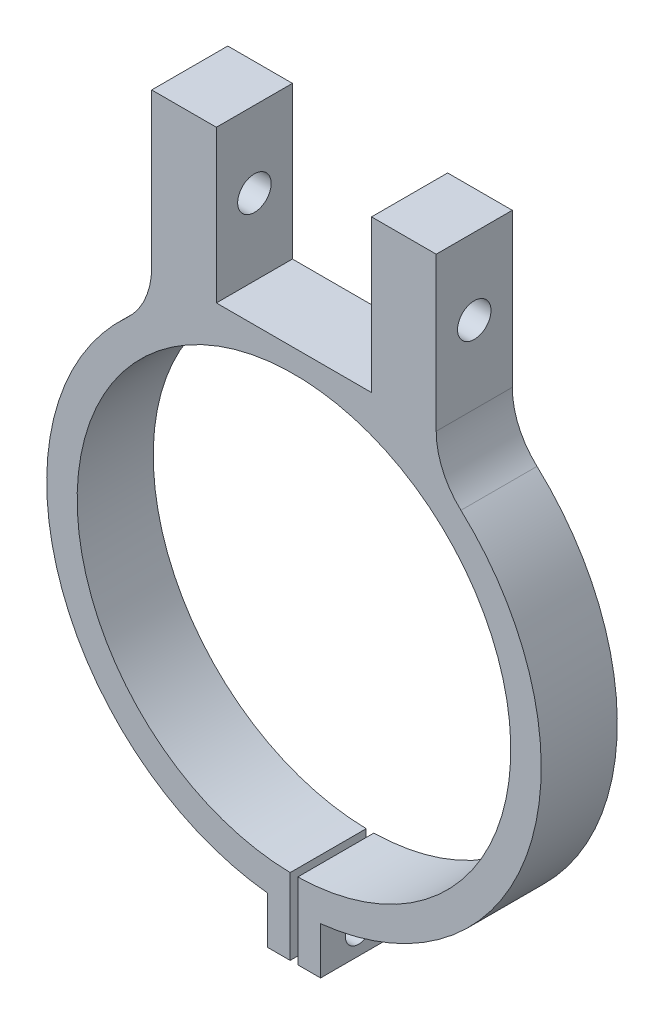
ISO-10303-21;
HEADER;
FILE_DESCRIPTION(('STEP AP214'),'2;1');
FILE_NAME('part.step','',(''),(''),'','','');
FILE_SCHEMA(('AUTOMOTIVE_DESIGN { 1 0 10303 214 1 1 1 1 }'));
ENDSEC;
DATA;
#1=APPLICATION_CONTEXT('core data for automotive mechanical design processes');
#2=APPLICATION_PROTOCOL_DEFINITION('international standard','automotive_design',2000,#1);
#3=PRODUCT_CONTEXT('',#1,'mechanical');
#4=PRODUCT('Part','Part','',(#3));
#5=PRODUCT_RELATED_PRODUCT_CATEGORY('part','',(#4));
#6=PRODUCT_DEFINITION_FORMATION('','',#4);
#7=PRODUCT_DEFINITION_CONTEXT('part definition',#1,'design');
#8=PRODUCT_DEFINITION('design','',#6,#7);
#9=PRODUCT_DEFINITION_SHAPE('','',#8);
#10=(LENGTH_UNIT() NAMED_UNIT(*) SI_UNIT(.MILLI.,.METRE.));
#11=(NAMED_UNIT(*) PLANE_ANGLE_UNIT() SI_UNIT($,.RADIAN.));
#12=(NAMED_UNIT(*) SI_UNIT($,.STERADIAN.) SOLID_ANGLE_UNIT());
#13=UNCERTAINTY_MEASURE_WITH_UNIT(LENGTH_MEASURE(1.E-05),#10,'distance_accuracy_value','');
#14=(GEOMETRIC_REPRESENTATION_CONTEXT(3) GLOBAL_UNCERTAINTY_ASSIGNED_CONTEXT((#13)) GLOBAL_UNIT_ASSIGNED_CONTEXT((#10,
#11,#12)) REPRESENTATION_CONTEXT('',''));
#15=CARTESIAN_POINT('',(0.,0.,0.));
#16=DIRECTION('',(0.,0.,1.));
#17=DIRECTION('',(1.,0.,0.));
#18=AXIS2_PLACEMENT_3D('',#15,#16,#17);
#19=CARTESIAN_POINT('',(3.5,-38.4961536185438,10.));
#20=DIRECTION('',(-1.,0.,0.));
#21=DIRECTION('',(0.,0.,1.));
#22=AXIS2_PLACEMENT_3D('',#19,#20,#21);
#23=PLANE('',#22);
#24=CARTESIAN_POINT('',(3.5,-35.4035712306754,5.));
#25=DIRECTION('',(-1.,0.,0.));
#26=DIRECTION('',(0.,0.,1.));
#27=AXIS2_PLACEMENT_3D('',#24,#25,#26);
#28=CIRCLE('',#27,1.75);
#29=CARTESIAN_POINT('',(3.5,-35.4035712306754,6.75));
#30=VERTEX_POINT('',#29);
#31=EDGE_CURVE('E227',#30,#30,#28,.T.);
#32=ORIENTED_EDGE('',*,*,#31,.T.);
#33=EDGE_LOOP('',(#32));
#34=FACE_BOUND('',#33,.T.);
#35=DIRECTION('',(0.,1.,0.));
#36=VECTOR('',#35,1.);
#37=CARTESIAN_POINT('',(3.5,-38.4961536185438,0.));
#38=LINE('',#37,#36);
#39=CARTESIAN_POINT('',(3.5,-38.4961536185438,0.));
#40=VERTEX_POINT('',#39);
#41=CARTESIAN_POINT('',(3.49999999999998,-32.310988842807,0.));
#42=VERTEX_POINT('',#41);
#43=EDGE_CURVE('E185',#40,#42,#38,.T.);
#44=ORIENTED_EDGE('',*,*,#43,.T.);
#45=DIRECTION('',(0.,0.,-1.));
#46=VECTOR('',#45,1.);
#47=CARTESIAN_POINT('',(3.49999999999998,-32.310988842807,10.));
#48=LINE('',#47,#46);
#49=CARTESIAN_POINT('',(3.49999999999998,-32.310988842807,10.));
#50=VERTEX_POINT('',#49);
#51=EDGE_CURVE('E166',#50,#42,#48,.T.);
#52=ORIENTED_EDGE('',*,*,#51,.F.);
#53=DIRECTION('',(0.,1.,0.));
#54=VECTOR('',#53,1.);
#55=CARTESIAN_POINT('',(3.5,-38.4961536185438,10.));
#56=LINE('',#55,#54);
#57=CARTESIAN_POINT('',(3.5,-38.4961536185438,10.));
#58=VERTEX_POINT('',#57);
#59=EDGE_CURVE('E173',#58,#50,#56,.T.);
#60=ORIENTED_EDGE('',*,*,#59,.F.);
#61=DIRECTION('',(0.,0.,-1.));
#62=VECTOR('',#61,1.);
#63=CARTESIAN_POINT('',(3.5,-38.4961536185438,10.));
#64=LINE('',#63,#62);
#65=EDGE_CURVE('E257',#58,#40,#64,.T.);
#66=ORIENTED_EDGE('',*,*,#65,.T.);
#67=EDGE_LOOP('',(#44,#52,#60,#66));
#68=FACE_BOUND('',#67,.T.);
#69=ADVANCED_FACE('F36',(#34,#68),#23,.F.);
#70=CARTESIAN_POINT('',(0.,0.,10.));
#71=DIRECTION('',(0.,0.,-1.));
#72=DIRECTION('',(-1.,0.,0.));
#73=AXIS2_PLACEMENT_3D('',#70,#71,#72);
#74=CYLINDRICAL_SURFACE('',#73,32.5);
#75=CARTESIAN_POINT('',(0.,0.,0.));
#76=DIRECTION('',(0.,0.,1.));
#77=DIRECTION('',(1.,0.,0.));
#78=AXIS2_PLACEMENT_3D('',#75,#76,#77);
#79=CIRCLE('',#78,32.5);
#80=CARTESIAN_POINT('',(21.9470588235294,23.970327678122,0.));
#81=VERTEX_POINT('',#80);
#82=EDGE_CURVE('E221',#42,#81,#79,.T.);
#83=ORIENTED_EDGE('',*,*,#82,.T.);
#84=DIRECTION('',(0.,0.,-1.));
#85=VECTOR('',#84,1.);
#86=CARTESIAN_POINT('',(21.9470588235294,23.970327678122,10.));
#87=LINE('',#86,#85);
#88=CARTESIAN_POINT('',(21.9470588235294,23.970327678122,10.));
#89=VERTEX_POINT('',#88);
#90=EDGE_CURVE('E169',#81,#89,#87,.F.);
#91=ORIENTED_EDGE('',*,*,#90,.T.);
#92=CARTESIAN_POINT('',(0.,0.,10.));
#93=DIRECTION('',(0.,0.,1.));
#94=DIRECTION('',(1.,0.,0.));
#95=AXIS2_PLACEMENT_3D('',#92,#93,#94);
#96=CIRCLE('',#95,32.5);
#97=EDGE_CURVE('E161',#50,#89,#96,.T.);
#98=ORIENTED_EDGE('',*,*,#97,.F.);
#99=ORIENTED_EDGE('',*,*,#51,.T.);
#100=EDGE_LOOP('',(#83,#91,#98,#99));
#101=FACE_BOUND('',#100,.T.);
#102=ADVANCED_FACE('F164',(#101),#74,.T.);
#103=CARTESIAN_POINT('',(18.7,51.5,10.));
#104=DIRECTION('',(-1.,0.,0.));
#105=DIRECTION('',(0.,0.,1.));
#106=AXIS2_PLACEMENT_3D('',#103,#104,#105);
#107=PLANE('',#106);
#108=CARTESIAN_POINT('',(18.7,41.5,5.));
#109=DIRECTION('',(-1.,0.,0.));
#110=DIRECTION('',(0.,0.,1.));
#111=AXIS2_PLACEMENT_3D('',#108,#109,#110);
#112=CIRCLE('',#111,2.2);
#113=CARTESIAN_POINT('',(18.7,41.5,7.2));
#114=VERTEX_POINT('',#113);
#115=EDGE_CURVE('E582',#114,#114,#112,.T.);
#116=ORIENTED_EDGE('',*,*,#115,.T.);
#117=EDGE_LOOP('',(#116));
#118=FACE_BOUND('',#117,.T.);
#119=DIRECTION('',(0.,1.,0.));
#120=VECTOR('',#119,1.);
#121=CARTESIAN_POINT('',(18.7,51.5,10.));
#122=LINE('',#121,#120);
#123=CARTESIAN_POINT('',(18.7,31.3458131175441,10.));
#124=VERTEX_POINT('',#123);
#125=CARTESIAN_POINT('',(18.7,51.5,10.));
#126=VERTEX_POINT('',#125);
#127=EDGE_CURVE('E172',#124,#126,#122,.T.);
#128=ORIENTED_EDGE('',*,*,#127,.F.);
#129=DIRECTION('',(0.,0.,1.));
#130=VECTOR('',#129,1.);
#131=CARTESIAN_POINT('',(18.7,31.3458131175441,0.));
#132=LINE('',#131,#130);
#133=CARTESIAN_POINT('',(18.7,31.3458131175441,0.));
#134=VERTEX_POINT('',#133);
#135=EDGE_CURVE('E186',#124,#134,#132,.F.);
#136=ORIENTED_EDGE('',*,*,#135,.T.);
#137=DIRECTION('',(0.,1.,0.));
#138=VECTOR('',#137,1.);
#139=CARTESIAN_POINT('',(18.7,51.5,0.));
#140=LINE('',#139,#138);
#141=CARTESIAN_POINT('',(18.7,51.5,0.));
#142=VERTEX_POINT('',#141);
#143=EDGE_CURVE('E223',#134,#142,#140,.T.);
#144=ORIENTED_EDGE('',*,*,#143,.T.);
#145=DIRECTION('',(0.,0.,-1.));
#146=VECTOR('',#145,1.);
#147=CARTESIAN_POINT('',(18.7,51.5,10.));
#148=LINE('',#147,#146);
#149=EDGE_CURVE('E187',#126,#142,#148,.T.);
#150=ORIENTED_EDGE('',*,*,#149,.F.);
#151=EDGE_LOOP('',(#128,#136,#144,#150));
#152=FACE_BOUND('',#151,.T.);
#153=ADVANCED_FACE('F214',(#118,#152),#107,.F.);
#154=CARTESIAN_POINT('',(10.2,51.5,10.));
#155=DIRECTION('',(0.,-1.,0.));
#156=DIRECTION('',(0.,0.,-1.));
#157=AXIS2_PLACEMENT_3D('',#154,#155,#156);
#158=PLANE('',#157);
#159=DIRECTION('',(-1.,0.,0.));
#160=VECTOR('',#159,1.);
#161=CARTESIAN_POINT('',(10.2,51.5,0.));
#162=LINE('',#161,#160);
#163=CARTESIAN_POINT('',(10.2,51.5,0.));
#164=VERTEX_POINT('',#163);
#165=EDGE_CURVE('E225',#142,#164,#162,.T.);
#166=ORIENTED_EDGE('',*,*,#165,.T.);
#167=DIRECTION('',(0.,0.,-1.));
#168=VECTOR('',#167,1.);
#169=CARTESIAN_POINT('',(10.2,51.5,10.));
#170=LINE('',#169,#168);
#171=CARTESIAN_POINT('',(10.2,51.5,10.));
#172=VERTEX_POINT('',#171);
#173=EDGE_CURVE('E192',#172,#164,#170,.T.);
#174=ORIENTED_EDGE('',*,*,#173,.F.);
#175=DIRECTION('',(-1.,0.,0.));
#176=VECTOR('',#175,1.);
#177=CARTESIAN_POINT('',(10.2,51.5,10.));
#178=LINE('',#177,#176);
#179=EDGE_CURVE('E217',#126,#172,#178,.T.);
#180=ORIENTED_EDGE('',*,*,#179,.F.);
#181=ORIENTED_EDGE('',*,*,#149,.T.);
#182=EDGE_LOOP('',(#166,#174,#180,#181));
#183=FACE_BOUND('',#182,.T.);
#184=ADVANCED_FACE('F501',(#183),#158,.F.);
#185=CARTESIAN_POINT('',(10.2,31.5,10.));
#186=DIRECTION('',(1.,0.,0.));
#187=DIRECTION('',(0.,0.,-1.));
#188=AXIS2_PLACEMENT_3D('',#185,#186,#187);
#189=PLANE('',#188);
#190=CARTESIAN_POINT('',(10.2,41.5,5.));
#191=DIRECTION('',(1.,0.,0.));
#192=DIRECTION('',(0.,0.,-1.));
#193=AXIS2_PLACEMENT_3D('',#190,#191,#192);
#194=CIRCLE('',#193,2.2);
#195=CARTESIAN_POINT('',(10.2,41.5,2.8));
#196=VERTEX_POINT('',#195);
#197=EDGE_CURVE('E585',#196,#196,#194,.T.);
#198=ORIENTED_EDGE('',*,*,#197,.T.);
#199=EDGE_LOOP('',(#198));
#200=FACE_BOUND('',#199,.T.);
#201=DIRECTION('',(0.,-1.,0.));
#202=VECTOR('',#201,1.);
#203=CARTESIAN_POINT('',(10.2,31.5,0.));
#204=LINE('',#203,#202);
#205=CARTESIAN_POINT('',(10.2,31.5,0.));
#206=VERTEX_POINT('',#205);
#207=EDGE_CURVE('E232',#164,#206,#204,.T.);
#208=ORIENTED_EDGE('',*,*,#207,.T.);
#209=DIRECTION('',(0.,0.,-1.));
#210=VECTOR('',#209,1.);
#211=CARTESIAN_POINT('',(10.2,31.5,10.));
#212=LINE('',#211,#210);
#213=CARTESIAN_POINT('',(10.2,31.5,10.));
#214=VERTEX_POINT('',#213);
#215=EDGE_CURVE('E286',#214,#206,#212,.T.);
#216=ORIENTED_EDGE('',*,*,#215,.F.);
#217=DIRECTION('',(0.,-1.,0.));
#218=VECTOR('',#217,1.);
#219=CARTESIAN_POINT('',(10.2,31.5,10.));
#220=LINE('',#219,#218);
#221=EDGE_CURVE('E295',#172,#214,#220,.T.);
#222=ORIENTED_EDGE('',*,*,#221,.F.);
#223=ORIENTED_EDGE('',*,*,#173,.T.);
#224=EDGE_LOOP('',(#208,#216,#222,#223));
#225=FACE_BOUND('',#224,.T.);
#226=ADVANCED_FACE('F293',(#200,#225),#189,.F.);
#227=CARTESIAN_POINT('',(-10.2,31.5,10.));
#228=DIRECTION('',(0.,-1.,0.));
#229=DIRECTION('',(0.,0.,-1.));
#230=AXIS2_PLACEMENT_3D('',#227,#228,#229);
#231=PLANE('',#230);
#232=DIRECTION('',(-1.,0.,0.));
#233=VECTOR('',#232,1.);
#234=CARTESIAN_POINT('',(-10.2,31.5,0.));
#235=LINE('',#234,#233);
#236=CARTESIAN_POINT('',(-10.2,31.5,0.));
#237=VERTEX_POINT('',#236);
#238=EDGE_CURVE('E234',#206,#237,#235,.T.);
#239=ORIENTED_EDGE('',*,*,#238,.T.);
#240=DIRECTION('',(0.,0.,-1.));
#241=VECTOR('',#240,1.);
#242=CARTESIAN_POINT('',(-10.2,31.5,10.));
#243=LINE('',#242,#241);
#244=CARTESIAN_POINT('',(-10.2,31.5,10.));
#245=VERTEX_POINT('',#244);
#246=EDGE_CURVE('E283',#245,#237,#243,.T.);
#247=ORIENTED_EDGE('',*,*,#246,.F.);
#248=DIRECTION('',(-1.,0.,0.));
#249=VECTOR('',#248,1.);
#250=CARTESIAN_POINT('',(-10.2,31.5,10.));
#251=LINE('',#250,#249);
#252=EDGE_CURVE('E311',#214,#245,#251,.T.);
#253=ORIENTED_EDGE('',*,*,#252,.F.);
#254=ORIENTED_EDGE('',*,*,#215,.T.);
#255=EDGE_LOOP('',(#239,#247,#253,#254));
#256=FACE_BOUND('',#255,.T.);
#257=ADVANCED_FACE('F302',(#256),#231,.F.);
#258=CARTESIAN_POINT('',(-10.2,31.5,10.));
#259=DIRECTION('',(-1.,0.,0.));
#260=DIRECTION('',(0.,0.,1.));
#261=AXIS2_PLACEMENT_3D('',#258,#259,#260);
#262=PLANE('',#261);
#263=CARTESIAN_POINT('',(-10.2,41.5,5.));
#264=DIRECTION('',(-1.,0.,0.));
#265=DIRECTION('',(0.,0.,1.));
#266=AXIS2_PLACEMENT_3D('',#263,#264,#265);
#267=CIRCLE('',#266,2.2);
#268=CARTESIAN_POINT('',(-10.2,41.5,7.2));
#269=VERTEX_POINT('',#268);
#270=EDGE_CURVE('E588',#269,#269,#267,.T.);
#271=ORIENTED_EDGE('',*,*,#270,.T.);
#272=EDGE_LOOP('',(#271));
#273=FACE_BOUND('',#272,.T.);
#274=DIRECTION('',(0.,1.,0.));
#275=VECTOR('',#274,1.);
#276=CARTESIAN_POINT('',(-10.2,31.5,0.));
#277=LINE('',#276,#275);
#278=CARTESIAN_POINT('',(-10.2,51.5,0.));
#279=VERTEX_POINT('',#278);
#280=EDGE_CURVE('E236',#237,#279,#277,.T.);
#281=ORIENTED_EDGE('',*,*,#280,.T.);
#282=DIRECTION('',(0.,0.,-1.));
#283=VECTOR('',#282,1.);
#284=CARTESIAN_POINT('',(-10.2,51.5,10.));
#285=LINE('',#284,#283);
#286=CARTESIAN_POINT('',(-10.2,51.5,10.));
#287=VERTEX_POINT('',#286);
#288=EDGE_CURVE('E280',#287,#279,#285,.T.);
#289=ORIENTED_EDGE('',*,*,#288,.F.);
#290=DIRECTION('',(0.,1.,0.));
#291=VECTOR('',#290,1.);
#292=CARTESIAN_POINT('',(-10.2,31.5,10.));
#293=LINE('',#292,#291);
#294=EDGE_CURVE('E308',#245,#287,#293,.T.);
#295=ORIENTED_EDGE('',*,*,#294,.F.);
#296=ORIENTED_EDGE('',*,*,#246,.T.);
#297=EDGE_LOOP('',(#281,#289,#295,#296));
#298=FACE_BOUND('',#297,.T.);
#299=ADVANCED_FACE('F306',(#273,#298),#262,.F.);
#300=CARTESIAN_POINT('',(-10.2,51.5,10.));
#301=DIRECTION('',(0.,-1.,0.));
#302=DIRECTION('',(0.,0.,-1.));
#303=AXIS2_PLACEMENT_3D('',#300,#301,#302);
#304=PLANE('',#303);
#305=DIRECTION('',(-1.,0.,0.));
#306=VECTOR('',#305,1.);
#307=CARTESIAN_POINT('',(-10.2,51.5,0.));
#308=LINE('',#307,#306);
#309=CARTESIAN_POINT('',(-18.7,51.5,0.));
#310=VERTEX_POINT('',#309);
#311=EDGE_CURVE('E238',#279,#310,#308,.T.);
#312=ORIENTED_EDGE('',*,*,#311,.T.);
#313=DIRECTION('',(0.,0.,-1.));
#314=VECTOR('',#313,1.);
#315=CARTESIAN_POINT('',(-18.7,51.5,10.));
#316=LINE('',#315,#314);
#317=CARTESIAN_POINT('',(-18.7,51.5,10.));
#318=VERTEX_POINT('',#317);
#319=EDGE_CURVE('E277',#318,#310,#316,.T.);
#320=ORIENTED_EDGE('',*,*,#319,.F.);
#321=DIRECTION('',(-1.,0.,0.));
#322=VECTOR('',#321,1.);
#323=CARTESIAN_POINT('',(-10.2,51.5,10.));
#324=LINE('',#323,#322);
#325=EDGE_CURVE('E310',#287,#318,#324,.T.);
#326=ORIENTED_EDGE('',*,*,#325,.F.);
#327=ORIENTED_EDGE('',*,*,#288,.T.);
#328=EDGE_LOOP('',(#312,#320,#326,#327));
#329=FACE_BOUND('',#328,.T.);
#330=ADVANCED_FACE('F366',(#329),#304,.F.);
#331=CARTESIAN_POINT('',(-18.7,51.5,10.));
#332=DIRECTION('',(1.,0.,0.));
#333=DIRECTION('',(0.,0.,-1.));
#334=AXIS2_PLACEMENT_3D('',#331,#332,#333);
#335=PLANE('',#334);
#336=CARTESIAN_POINT('',(-18.7,41.5,5.));
#337=DIRECTION('',(-1.,0.,0.));
#338=DIRECTION('',(0.,-1.,0.));
#339=AXIS2_PLACEMENT_3D('',#336,#337,#338);
#340=CIRCLE('',#339,2.2);
#341=CARTESIAN_POINT('',(-18.7,39.3,5.));
#342=VERTEX_POINT('',#341);
#343=EDGE_CURVE('E591',#342,#342,#340,.T.);
#344=ORIENTED_EDGE('',*,*,#343,.F.);
#345=EDGE_LOOP('',(#344));
#346=FACE_BOUND('',#345,.T.);
#347=DIRECTION('',(0.,-1.,0.));
#348=VECTOR('',#347,1.);
#349=CARTESIAN_POINT('',(-18.7,51.5,0.));
#350=LINE('',#349,#348);
#351=CARTESIAN_POINT('',(-18.7,31.3458131175441,0.));
#352=VERTEX_POINT('',#351);
#353=EDGE_CURVE('E240',#310,#352,#350,.T.);
#354=ORIENTED_EDGE('',*,*,#353,.T.);
#355=DIRECTION('',(0.,0.,1.));
#356=VECTOR('',#355,1.);
#357=CARTESIAN_POINT('',(-18.7,31.3458131175441,10.));
#358=LINE('',#357,#356);
#359=CARTESIAN_POINT('',(-18.7,31.3458131175441,10.));
#360=VERTEX_POINT('',#359);
#361=EDGE_CURVE('E51',#352,#360,#358,.T.);
#362=ORIENTED_EDGE('',*,*,#361,.T.);
#363=DIRECTION('',(0.,-1.,0.));
#364=VECTOR('',#363,1.);
#365=CARTESIAN_POINT('',(-18.7,51.5,10.));
#366=LINE('',#365,#364);
#367=EDGE_CURVE('E313',#318,#360,#366,.T.);
#368=ORIENTED_EDGE('',*,*,#367,.F.);
#369=ORIENTED_EDGE('',*,*,#319,.T.);
#370=EDGE_LOOP('',(#354,#362,#368,#369));
#371=FACE_BOUND('',#370,.T.);
#372=ADVANCED_FACE('F364',(#346,#371),#335,.F.);
#373=CARTESIAN_POINT('',(0.,0.,10.));
#374=DIRECTION('',(0.,0.,-1.));
#375=DIRECTION('',(-1.,0.,0.));
#376=AXIS2_PLACEMENT_3D('',#373,#374,#375);
#377=CYLINDRICAL_SURFACE('',#376,32.5);
#378=CARTESIAN_POINT('',(0.,0.,10.));
#379=DIRECTION('',(0.,0.,1.));
#380=DIRECTION('',(1.,0.,0.));
#381=AXIS2_PLACEMENT_3D('',#378,#379,#380);
#382=CIRCLE('',#381,32.5);
#383=CARTESIAN_POINT('',(-21.9470588235294,23.970327678122,10.));
#384=VERTEX_POINT('',#383);
#385=CARTESIAN_POINT('',(-3.5,-32.310988842807,10.));
#386=VERTEX_POINT('',#385);
#387=EDGE_CURVE('E319',#384,#386,#382,.T.);
#388=ORIENTED_EDGE('',*,*,#387,.F.);
#389=DIRECTION('',(0.,0.,-1.));
#390=VECTOR('',#389,1.);
#391=CARTESIAN_POINT('',(-21.9470588235294,23.970327678122,10.));
#392=LINE('',#391,#390);
#393=CARTESIAN_POINT('',(-21.9470588235294,23.970327678122,0.));
#394=VERTEX_POINT('',#393);
#395=EDGE_CURVE('E202',#384,#394,#392,.T.);
#396=ORIENTED_EDGE('',*,*,#395,.T.);
#397=CARTESIAN_POINT('',(0.,0.,0.));
#398=DIRECTION('',(0.,0.,1.));
#399=DIRECTION('',(1.,0.,0.));
#400=AXIS2_PLACEMENT_3D('',#397,#398,#399);
#401=CIRCLE('',#400,32.5);
#402=CARTESIAN_POINT('',(-3.5,-32.310988842807,0.));
#403=VERTEX_POINT('',#402);
#404=EDGE_CURVE('E242',#394,#403,#401,.T.);
#405=ORIENTED_EDGE('',*,*,#404,.T.);
#406=DIRECTION('',(0.,0.,-1.));
#407=VECTOR('',#406,1.);
#408=CARTESIAN_POINT('',(-3.5,-32.310988842807,10.));
#409=LINE('',#408,#407);
#410=EDGE_CURVE('E274',#386,#403,#409,.T.);
#411=ORIENTED_EDGE('',*,*,#410,.F.);
#412=EDGE_LOOP('',(#388,#396,#405,#411));
#413=FACE_BOUND('',#412,.T.);
#414=ADVANCED_FACE('F359',(#413),#377,.T.);
#415=CARTESIAN_POINT('',(-3.5,-38.4961536185438,10.));
#416=DIRECTION('',(1.,0.,0.));
#417=DIRECTION('',(0.,1.,0.));
#418=AXIS2_PLACEMENT_3D('',#415,#416,#417);
#419=PLANE('',#418);
#420=CARTESIAN_POINT('',(-3.50000000000001,-35.4035712306754,5.));
#421=DIRECTION('',(-1.,0.,0.));
#422=DIRECTION('',(0.,0.,1.));
#423=AXIS2_PLACEMENT_3D('',#420,#421,#422);
#424=CIRCLE('',#423,1.75);
#425=CARTESIAN_POINT('',(-3.50000000000001,-35.4035712306754,6.75));
#426=VERTEX_POINT('',#425);
#427=EDGE_CURVE('E199',#426,#426,#424,.T.);
#428=ORIENTED_EDGE('',*,*,#427,.F.);
#429=EDGE_LOOP('',(#428));
#430=FACE_BOUND('',#429,.T.);
#431=DIRECTION('',(0.,-1.,0.));
#432=VECTOR('',#431,1.);
#433=CARTESIAN_POINT('',(-3.5,-38.4961536185438,0.));
#434=LINE('',#433,#432);
#435=CARTESIAN_POINT('',(-3.5,-38.4961536185438,0.));
#436=VERTEX_POINT('',#435);
#437=EDGE_CURVE('E244',#403,#436,#434,.T.);
#438=ORIENTED_EDGE('',*,*,#437,.T.);
#439=DIRECTION('',(0.,0.,-1.));
#440=VECTOR('',#439,1.);
#441=CARTESIAN_POINT('',(-3.5,-38.4961536185438,10.));
#442=LINE('',#441,#440);
#443=CARTESIAN_POINT('',(-3.5,-38.4961536185438,10.));
#444=VERTEX_POINT('',#443);
#445=EDGE_CURVE('E271',#444,#436,#442,.T.);
#446=ORIENTED_EDGE('',*,*,#445,.F.);
#447=DIRECTION('',(0.,-1.,0.));
#448=VECTOR('',#447,1.);
#449=CARTESIAN_POINT('',(-3.5,-38.4961536185438,10.));
#450=LINE('',#449,#448);
#451=EDGE_CURVE('E321',#386,#444,#450,.T.);
#452=ORIENTED_EDGE('',*,*,#451,.F.);
#453=ORIENTED_EDGE('',*,*,#410,.T.);
#454=EDGE_LOOP('',(#438,#446,#452,#453));
#455=FACE_BOUND('',#454,.T.);
#456=ADVANCED_FACE('F355',(#430,#455),#419,.F.);
#457=CARTESIAN_POINT('',(-0.499999999999995,-38.4961536185438,10.));
#458=DIRECTION('',(0.,1.,0.));
#459=DIRECTION('',(0.,0.,1.));
#460=AXIS2_PLACEMENT_3D('',#457,#458,#459);
#461=PLANE('',#460);
#462=DIRECTION('',(1.,0.,0.));
#463=VECTOR('',#462,1.);
#464=CARTESIAN_POINT('',(-0.499999999999995,-38.4961536185438,0.));
#465=LINE('',#464,#463);
#466=CARTESIAN_POINT('',(-0.499999999999995,-38.4961536185438,0.));
#467=VERTEX_POINT('',#466);
#468=EDGE_CURVE('E246',#436,#467,#465,.T.);
#469=ORIENTED_EDGE('',*,*,#468,.T.);
#470=DIRECTION('',(0.,0.,-1.));
#471=VECTOR('',#470,1.);
#472=CARTESIAN_POINT('',(-0.499999999999995,-38.4961536185438,10.));
#473=LINE('',#472,#471);
#474=CARTESIAN_POINT('',(-0.499999999999995,-38.4961536185438,10.));
#475=VERTEX_POINT('',#474);
#476=EDGE_CURVE('E268',#475,#467,#473,.T.);
#477=ORIENTED_EDGE('',*,*,#476,.F.);
#478=DIRECTION('',(1.,0.,0.));
#479=VECTOR('',#478,1.);
#480=CARTESIAN_POINT('',(-0.499999999999995,-38.4961536185438,10.));
#481=LINE('',#480,#479);
#482=EDGE_CURVE('E323',#444,#475,#481,.T.);
#483=ORIENTED_EDGE('',*,*,#482,.F.);
#484=ORIENTED_EDGE('',*,*,#445,.T.);
#485=EDGE_LOOP('',(#469,#477,#483,#484));
#486=FACE_BOUND('',#485,.T.);
#487=ADVANCED_FACE('F350',(#486),#461,.F.);
#488=CARTESIAN_POINT('',(-0.499999999999997,-28.49561369755,10.));
#489=DIRECTION('',(-1.,0.,0.));
#490=DIRECTION('',(0.,-1.,0.));
#491=AXIS2_PLACEMENT_3D('',#488,#489,#490);
#492=PLANE('',#491);
#493=CARTESIAN_POINT('',(-0.499999999999994,-35.4035712306754,5.));
#494=DIRECTION('',(-1.,0.,0.));
#495=DIRECTION('',(0.,-1.,0.));
#496=AXIS2_PLACEMENT_3D('',#493,#494,#495);
#497=CIRCLE('',#496,1.75);
#498=CARTESIAN_POINT('',(-0.499999999999993,-37.1535712306754,5.));
#499=VERTEX_POINT('',#498);
#500=EDGE_CURVE('E198',#499,#499,#497,.T.);
#501=ORIENTED_EDGE('',*,*,#500,.T.);
#502=EDGE_LOOP('',(#501));
#503=FACE_BOUND('',#502,.T.);
#504=DIRECTION('',(0.,1.,0.));
#505=VECTOR('',#504,1.);
#506=CARTESIAN_POINT('',(-0.499999999999997,-28.49561369755,0.));
#507=LINE('',#506,#505);
#508=CARTESIAN_POINT('',(-0.499999999999976,-28.49561369755,0.));
#509=VERTEX_POINT('',#508);
#510=EDGE_CURVE('E249',#467,#509,#507,.T.);
#511=ORIENTED_EDGE('',*,*,#510,.T.);
#512=DIRECTION('',(0.,0.,-1.));
#513=VECTOR('',#512,1.);
#514=CARTESIAN_POINT('',(-0.499999999999976,-28.49561369755,10.));
#515=LINE('',#514,#513);
#516=CARTESIAN_POINT('',(-0.499999999999976,-28.49561369755,10.));
#517=VERTEX_POINT('',#516);
#518=EDGE_CURVE('E265',#517,#509,#515,.T.);
#519=ORIENTED_EDGE('',*,*,#518,.F.);
#520=DIRECTION('',(0.,1.,0.));
#521=VECTOR('',#520,1.);
#522=CARTESIAN_POINT('',(-0.499999999999996,-32.4961536185438,10.));
#523=LINE('',#522,#521);
#524=EDGE_CURVE('E325',#475,#517,#523,.T.);
#525=ORIENTED_EDGE('',*,*,#524,.F.);
#526=ORIENTED_EDGE('',*,*,#476,.T.);
#527=EDGE_LOOP('',(#511,#519,#525,#526));
#528=FACE_BOUND('',#527,.T.);
#529=ADVANCED_FACE('F345',(#503,#528),#492,.F.);
#530=CARTESIAN_POINT('',(0.,0.,10.));
#531=DIRECTION('',(0.,0.,-1.));
#532=DIRECTION('',(-1.,0.,0.));
#533=AXIS2_PLACEMENT_3D('',#530,#531,#532);
#534=CYLINDRICAL_SURFACE('',#533,28.5);
#535=CARTESIAN_POINT('',(0.,0.,0.));
#536=DIRECTION('',(0.,0.,-1.));
#537=DIRECTION('',(1.,0.,0.));
#538=AXIS2_PLACEMENT_3D('',#535,#536,#537);
#539=CIRCLE('',#538,28.5);
#540=CARTESIAN_POINT('',(0.500000000000003,-28.49561369755,0.));
#541=VERTEX_POINT('',#540);
#542=EDGE_CURVE('E251',#509,#541,#539,.T.);
#543=ORIENTED_EDGE('',*,*,#542,.T.);
#544=DIRECTION('',(0.,0.,-1.));
#545=VECTOR('',#544,1.);
#546=CARTESIAN_POINT('',(0.500000000000003,-28.49561369755,10.));
#547=LINE('',#546,#545);
#548=CARTESIAN_POINT('',(0.500000000000003,-28.49561369755,10.));
#549=VERTEX_POINT('',#548);
#550=EDGE_CURVE('E262',#549,#541,#547,.T.);
#551=ORIENTED_EDGE('',*,*,#550,.F.);
#552=CARTESIAN_POINT('',(0.,0.,10.));
#553=DIRECTION('',(0.,0.,-1.));
#554=DIRECTION('',(1.,0.,0.));
#555=AXIS2_PLACEMENT_3D('',#552,#553,#554);
#556=CIRCLE('',#555,28.5);
#557=EDGE_CURVE('E327',#517,#549,#556,.T.);
#558=ORIENTED_EDGE('',*,*,#557,.F.);
#559=ORIENTED_EDGE('',*,*,#518,.T.);
#560=EDGE_LOOP('',(#543,#551,#558,#559));
#561=FACE_BOUND('',#560,.T.);
#562=ADVANCED_FACE('F341',(#561),#534,.F.);
#563=CARTESIAN_POINT('',(0.500000000000004,-32.4961536185438,10.));
#564=DIRECTION('',(1.,0.,0.));
#565=DIRECTION('',(0.,1.,0.));
#566=AXIS2_PLACEMENT_3D('',#563,#564,#565);
#567=PLANE('',#566);
#568=CARTESIAN_POINT('',(0.5,-35.4035712306754,5.));
#569=DIRECTION('',(1.,0.,0.));
#570=DIRECTION('',(0.,1.,0.));
#571=AXIS2_PLACEMENT_3D('',#568,#569,#570);
#572=CIRCLE('',#571,1.75);
#573=CARTESIAN_POINT('',(0.5,-33.6535712306754,5.));
#574=VERTEX_POINT('',#573);
#575=EDGE_CURVE('E196',#574,#574,#572,.T.);
#576=ORIENTED_EDGE('',*,*,#575,.T.);
#577=EDGE_LOOP('',(#576));
#578=FACE_BOUND('',#577,.T.);
#579=DIRECTION('',(0.,-1.,0.));
#580=VECTOR('',#579,1.);
#581=CARTESIAN_POINT('',(0.500000000000004,-32.4961536185438,0.));
#582=LINE('',#581,#580);
#583=CARTESIAN_POINT('',(0.500000000000005,-38.4961536185438,0.));
#584=VERTEX_POINT('',#583);
#585=EDGE_CURVE('E254',#541,#584,#582,.T.);
#586=ORIENTED_EDGE('',*,*,#585,.T.);
#587=DIRECTION('',(0.,0.,-1.));
#588=VECTOR('',#587,1.);
#589=CARTESIAN_POINT('',(0.500000000000005,-38.4961536185438,10.));
#590=LINE('',#589,#588);
#591=CARTESIAN_POINT('',(0.500000000000005,-38.4961536185438,10.));
#592=VERTEX_POINT('',#591);
#593=EDGE_CURVE('E259',#592,#584,#590,.T.);
#594=ORIENTED_EDGE('',*,*,#593,.F.);
#595=DIRECTION('',(0.,-1.,0.));
#596=VECTOR('',#595,1.);
#597=CARTESIAN_POINT('',(0.500000000000003,-28.49561369755,10.));
#598=LINE('',#597,#596);
#599=EDGE_CURVE('E329',#549,#592,#598,.T.);
#600=ORIENTED_EDGE('',*,*,#599,.F.);
#601=ORIENTED_EDGE('',*,*,#550,.T.);
#602=EDGE_LOOP('',(#586,#594,#600,#601));
#603=FACE_BOUND('',#602,.T.);
#604=ADVANCED_FACE('F335',(#578,#603),#567,.F.);
#605=CARTESIAN_POINT('',(0.500000000000005,-38.4961536185438,10.));
#606=DIRECTION('',(0.,1.,0.));
#607=DIRECTION('',(0.,0.,1.));
#608=AXIS2_PLACEMENT_3D('',#605,#606,#607);
#609=PLANE('',#608);
#610=DIRECTION('',(1.,0.,0.));
#611=VECTOR('',#610,1.);
#612=CARTESIAN_POINT('',(0.500000000000005,-38.4961536185438,0.));
#613=LINE('',#612,#611);
#614=EDGE_CURVE('E182',#584,#40,#613,.T.);
#615=ORIENTED_EDGE('',*,*,#614,.T.);
#616=ORIENTED_EDGE('',*,*,#65,.F.);
#617=DIRECTION('',(1.,0.,0.));
#618=VECTOR('',#617,1.);
#619=CARTESIAN_POINT('',(0.500000000000005,-38.4961536185438,10.));
#620=LINE('',#619,#618);
#621=EDGE_CURVE('E178',#592,#58,#620,.T.);
#622=ORIENTED_EDGE('',*,*,#621,.F.);
#623=ORIENTED_EDGE('',*,*,#593,.T.);
#624=EDGE_LOOP('',(#615,#616,#622,#623));
#625=FACE_BOUND('',#624,.T.);
#626=ADVANCED_FACE('F338',(#625),#609,.F.);
#627=CARTESIAN_POINT('',(0.,0.,10.));
#628=DIRECTION('',(0.,0.,1.));
#629=DIRECTION('',(1.,0.,0.));
#630=AXIS2_PLACEMENT_3D('',#627,#628,#629);
#631=PLANE('',#630);
#632=ORIENTED_EDGE('',*,*,#59,.T.);
#633=ORIENTED_EDGE('',*,*,#97,.T.);
#634=CARTESIAN_POINT('',(28.7,31.3458131175441,10.));
#635=DIRECTION('',(0.,0.,1.));
#636=DIRECTION('',(1.,0.,0.));
#637=AXIS2_PLACEMENT_3D('',#634,#635,#636);
#638=CIRCLE('',#637,10.);
#639=EDGE_CURVE('E208',#89,#124,#638,.F.);
#640=ORIENTED_EDGE('',*,*,#639,.T.);
#641=ORIENTED_EDGE('',*,*,#127,.T.);
#642=ORIENTED_EDGE('',*,*,#179,.T.);
#643=ORIENTED_EDGE('',*,*,#221,.T.);
#644=ORIENTED_EDGE('',*,*,#252,.T.);
#645=ORIENTED_EDGE('',*,*,#294,.T.);
#646=ORIENTED_EDGE('',*,*,#325,.T.);
#647=ORIENTED_EDGE('',*,*,#367,.T.);
#648=CARTESIAN_POINT('',(-28.7,31.3458131175441,10.));
#649=DIRECTION('',(0.,0.,1.));
#650=DIRECTION('',(1.,0.,0.));
#651=AXIS2_PLACEMENT_3D('',#648,#649,#650);
#652=CIRCLE('',#651,10.);
#653=EDGE_CURVE('E11',#360,#384,#652,.F.);
#654=ORIENTED_EDGE('',*,*,#653,.T.);
#655=ORIENTED_EDGE('',*,*,#387,.T.);
#656=ORIENTED_EDGE('',*,*,#451,.T.);
#657=ORIENTED_EDGE('',*,*,#482,.T.);
#658=ORIENTED_EDGE('',*,*,#524,.T.);
#659=ORIENTED_EDGE('',*,*,#557,.T.);
#660=ORIENTED_EDGE('',*,*,#599,.T.);
#661=ORIENTED_EDGE('',*,*,#621,.T.);
#662=EDGE_LOOP('',(#632,#633,#640,#641,#642,#643,#644,#645,#646,#647,#654,#655,#656,#657,#658,
#659,#660,#661));
#663=FACE_BOUND('',#662,.T.);
#664=ADVANCED_FACE('F176',(#663),#631,.T.);
#665=CARTESIAN_POINT('',(0.,0.,0.));
#666=DIRECTION('',(0.,0.,1.));
#667=DIRECTION('',(1.,0.,0.));
#668=AXIS2_PLACEMENT_3D('',#665,#666,#667);
#669=PLANE('',#668);
#670=ORIENTED_EDGE('',*,*,#43,.F.);
#671=ORIENTED_EDGE('',*,*,#614,.F.);
#672=ORIENTED_EDGE('',*,*,#585,.F.);
#673=ORIENTED_EDGE('',*,*,#542,.F.);
#674=ORIENTED_EDGE('',*,*,#510,.F.);
#675=ORIENTED_EDGE('',*,*,#468,.F.);
#676=ORIENTED_EDGE('',*,*,#437,.F.);
#677=ORIENTED_EDGE('',*,*,#404,.F.);
#678=CARTESIAN_POINT('',(-28.7,31.3458131175441,0.));
#679=DIRECTION('',(0.,0.,1.));
#680=DIRECTION('',(1.,0.,0.));
#681=AXIS2_PLACEMENT_3D('',#678,#679,#680);
#682=CIRCLE('',#681,10.);
#683=EDGE_CURVE('E44',#394,#352,#682,.T.);
#684=ORIENTED_EDGE('',*,*,#683,.T.);
#685=ORIENTED_EDGE('',*,*,#353,.F.);
#686=ORIENTED_EDGE('',*,*,#311,.F.);
#687=ORIENTED_EDGE('',*,*,#280,.F.);
#688=ORIENTED_EDGE('',*,*,#238,.F.);
#689=ORIENTED_EDGE('',*,*,#207,.F.);
#690=ORIENTED_EDGE('',*,*,#165,.F.);
#691=ORIENTED_EDGE('',*,*,#143,.F.);
#692=CARTESIAN_POINT('',(28.7,31.3458131175441,0.));
#693=DIRECTION('',(0.,0.,1.));
#694=DIRECTION('',(1.,0.,0.));
#695=AXIS2_PLACEMENT_3D('',#692,#693,#694);
#696=CIRCLE('',#695,10.);
#697=EDGE_CURVE('E206',#134,#81,#696,.T.);
#698=ORIENTED_EDGE('',*,*,#697,.T.);
#699=ORIENTED_EDGE('',*,*,#82,.F.);
#700=EDGE_LOOP('',(#670,#671,#672,#673,#674,#675,#676,#677,#684,#685,#686,#687,#688,#689,#690,
#691,#698,#699));
#701=FACE_BOUND('',#700,.T.);
#702=ADVANCED_FACE('F220',(#701),#669,.F.);
#703=CARTESIAN_POINT('',(32.5,-35.4035712306754,5.));
#704=DIRECTION('',(-1.,0.,0.));
#705=DIRECTION('',(0.,0.,1.));
#706=AXIS2_PLACEMENT_3D('',#703,#704,#705);
#707=CYLINDRICAL_SURFACE('',#706,1.75);
#708=ORIENTED_EDGE('',*,*,#575,.F.);
#709=EDGE_LOOP('',(#708));
#710=FACE_BOUND('',#709,.T.);
#711=ORIENTED_EDGE('',*,*,#31,.F.);
#712=EDGE_LOOP('',(#711));
#713=FACE_BOUND('',#712,.T.);
#714=ADVANCED_FACE('F403',(#710,#713),#707,.F.);
#715=ORIENTED_EDGE('',*,*,#427,.T.);
#716=EDGE_LOOP('',(#715));
#717=FACE_BOUND('',#716,.T.);
#718=ORIENTED_EDGE('',*,*,#500,.F.);
#719=EDGE_LOOP('',(#718));
#720=FACE_BOUND('',#719,.T.);
#721=ADVANCED_FACE('F398',(#717,#720),#707,.F.);
#722=CARTESIAN_POINT('',(32.5,41.5,5.));
#723=DIRECTION('',(-1.,0.,0.));
#724=DIRECTION('',(0.,-1.,0.));
#725=AXIS2_PLACEMENT_3D('',#722,#723,#724);
#726=CYLINDRICAL_SURFACE('',#725,2.2);
#727=ORIENTED_EDGE('',*,*,#343,.T.);
#728=EDGE_LOOP('',(#727));
#729=FACE_BOUND('',#728,.T.);
#730=ORIENTED_EDGE('',*,*,#270,.F.);
#731=EDGE_LOOP('',(#730));
#732=FACE_BOUND('',#731,.T.);
#733=ADVANCED_FACE('F392',(#729,#732),#726,.F.);
#734=ORIENTED_EDGE('',*,*,#197,.F.);
#735=EDGE_LOOP('',(#734));
#736=FACE_BOUND('',#735,.T.);
#737=ORIENTED_EDGE('',*,*,#115,.F.);
#738=EDGE_LOOP('',(#737));
#739=FACE_BOUND('',#738,.T.);
#740=ADVANCED_FACE('F387',(#736,#739),#726,.F.);
#741=CARTESIAN_POINT('',(28.7,31.3458131175441,10.));
#742=DIRECTION('',(0.,0.,-1.));
#743=DIRECTION('',(-1.,0.,0.));
#744=AXIS2_PLACEMENT_3D('',#741,#742,#743);
#745=CYLINDRICAL_SURFACE('',#744,10.);
#746=ORIENTED_EDGE('',*,*,#639,.F.);
#747=ORIENTED_EDGE('',*,*,#90,.F.);
#748=ORIENTED_EDGE('',*,*,#697,.F.);
#749=ORIENTED_EDGE('',*,*,#135,.F.);
#750=EDGE_LOOP('',(#746,#747,#748,#749));
#751=FACE_BOUND('',#750,.T.);
#752=ADVANCED_FACE('F219',(#751),#745,.F.);
#753=CARTESIAN_POINT('',(-28.7,31.3458131175441,10.));
#754=DIRECTION('',(0.,0.,-1.));
#755=DIRECTION('',(-1.,0.,0.));
#756=AXIS2_PLACEMENT_3D('',#753,#754,#755);
#757=CYLINDRICAL_SURFACE('',#756,10.);
#758=ORIENTED_EDGE('',*,*,#653,.F.);
#759=ORIENTED_EDGE('',*,*,#361,.F.);
#760=ORIENTED_EDGE('',*,*,#683,.F.);
#761=ORIENTED_EDGE('',*,*,#395,.F.);
#762=EDGE_LOOP('',(#758,#759,#760,#761));
#763=FACE_BOUND('',#762,.T.);
#764=ADVANCED_FACE('F38',(#763),#757,.F.);
#765=CLOSED_SHELL('',(#69,#102,#153,#184,#226,#257,#299,#330,#372,#414,#456,#487,#529,#562,#604,
#626,#664,#702,#714,#721,#733,#740,#752,#764));
#766=MANIFOLD_SOLID_BREP('B2',#765);
#767=ADVANCED_BREP_SHAPE_REPRESENTATION('',(#18,#766),#14);
#768=SHAPE_DEFINITION_REPRESENTATION(#9,#767);
ENDSEC;
END-ISO-10303-21;
